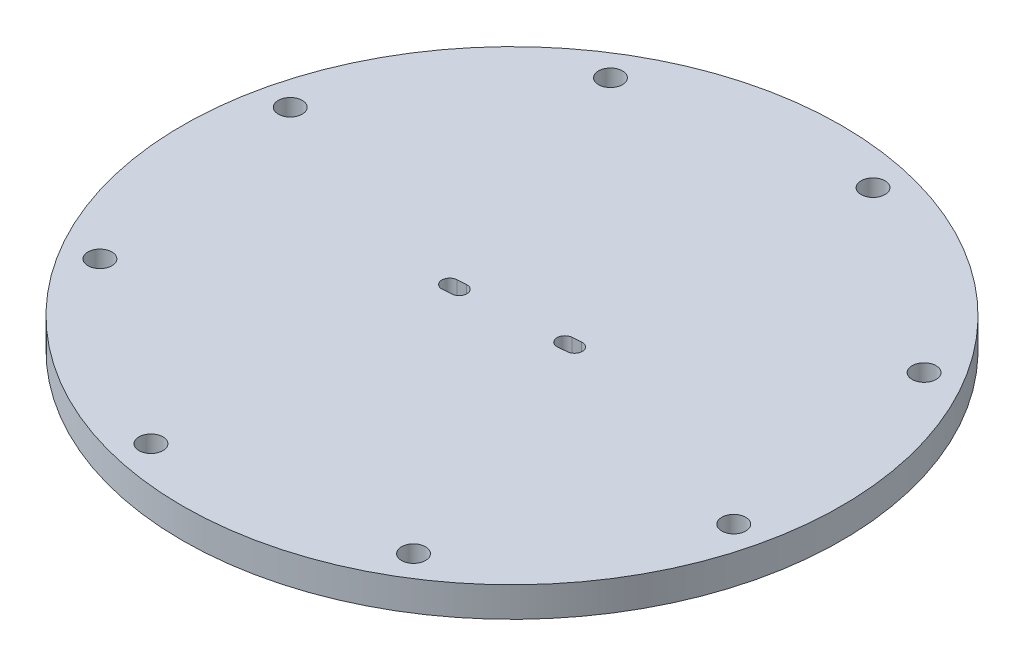
ISO-10303-21;
HEADER;
FILE_DESCRIPTION(('STEP AP214'),'2;1');
FILE_NAME('part.step','',(''),(''),'','','');
FILE_SCHEMA(('AUTOMOTIVE_DESIGN { 1 0 10303 214 1 1 1 1 }'));
ENDSEC;
DATA;
#1=APPLICATION_CONTEXT('core data for automotive mechanical design processes');
#2=APPLICATION_PROTOCOL_DEFINITION('international standard','automotive_design',2000,#1);
#3=PRODUCT_CONTEXT('',#1,'mechanical');
#4=PRODUCT('Part','Part','',(#3));
#5=PRODUCT_RELATED_PRODUCT_CATEGORY('part','',(#4));
#6=PRODUCT_DEFINITION_FORMATION('','',#4);
#7=PRODUCT_DEFINITION_CONTEXT('part definition',#1,'design');
#8=PRODUCT_DEFINITION('design','',#6,#7);
#9=PRODUCT_DEFINITION_SHAPE('','',#8);
#10=(LENGTH_UNIT() NAMED_UNIT(*) SI_UNIT(.MILLI.,.METRE.));
#11=(NAMED_UNIT(*) PLANE_ANGLE_UNIT() SI_UNIT($,.RADIAN.));
#12=(NAMED_UNIT(*) SI_UNIT($,.STERADIAN.) SOLID_ANGLE_UNIT());
#13=UNCERTAINTY_MEASURE_WITH_UNIT(LENGTH_MEASURE(1.E-05),#10,'distance_accuracy_value','');
#14=(GEOMETRIC_REPRESENTATION_CONTEXT(3) GLOBAL_UNCERTAINTY_ASSIGNED_CONTEXT((#13)) GLOBAL_UNIT_ASSIGNED_CONTEXT((#10,
#11,#12)) REPRESENTATION_CONTEXT('',''));
#15=CARTESIAN_POINT('',(0.,0.,0.));
#16=DIRECTION('',(0.,0.,1.));
#17=DIRECTION('',(1.,0.,0.));
#18=AXIS2_PLACEMENT_3D('',#15,#16,#17);
#19=CARTESIAN_POINT('',(0.,10.,0.));
#20=DIRECTION('',(0.,-1.,0.));
#21=DIRECTION('',(0.,0.,-1.));
#22=AXIS2_PLACEMENT_3D('',#19,#20,#21);
#23=CYLINDRICAL_SURFACE('',#22,110.);
#24=CARTESIAN_POINT('',(0.,10.,0.));
#25=DIRECTION('',(0.,1.,0.));
#26=DIRECTION('',(0.,0.,1.));
#27=AXIS2_PLACEMENT_3D('',#24,#25,#26);
#28=CIRCLE('',#27,110.);
#29=CARTESIAN_POINT('',(0.,10.,110.));
#30=VERTEX_POINT('',#29);
#31=EDGE_CURVE('E11',#30,#30,#28,.T.);
#32=ORIENTED_EDGE('',*,*,#31,.F.);
#33=EDGE_LOOP('',(#32));
#34=FACE_BOUND('',#33,.T.);
#35=CARTESIAN_POINT('',(0.,0.,0.));
#36=DIRECTION('',(0.,1.,0.));
#37=DIRECTION('',(0.,0.,1.));
#38=AXIS2_PLACEMENT_3D('',#35,#36,#37);
#39=CIRCLE('',#38,110.);
#40=CARTESIAN_POINT('',(0.,0.,110.));
#41=VERTEX_POINT('',#40);
#42=EDGE_CURVE('E40',#41,#41,#39,.T.);
#43=ORIENTED_EDGE('',*,*,#42,.T.);
#44=EDGE_LOOP('',(#43));
#45=FACE_BOUND('',#44,.T.);
#46=ADVANCED_FACE('F37',(#34,#45),#23,.T.);
#47=CARTESIAN_POINT('',(0.,10.,0.));
#48=DIRECTION('',(0.,1.,0.));
#49=DIRECTION('',(0.,0.,1.));
#50=AXIS2_PLACEMENT_3D('',#47,#48,#49);
#51=PLANE('',#50);
#52=CARTESIAN_POINT('',(-23.2434413577419,10.,97.2612072403444));
#53=DIRECTION('',(0.,1.,0.));
#54=DIRECTION('',(0.,0.,1.));
#55=AXIS2_PLACEMENT_3D('',#52,#53,#54);
#56=CIRCLE('',#55,4.00000000000002);
#57=CARTESIAN_POINT('',(-23.2434413577419,10.,101.261207240344));
#58=VERTEX_POINT('',#57);
#59=EDGE_CURVE('E302',#58,#58,#56,.T.);
#60=ORIENTED_EDGE('',*,*,#59,.F.);
#61=EDGE_LOOP('',(#60));
#62=FACE_BOUND('',#61,.T.);
#63=CARTESIAN_POINT('',(52.3384641838666,10.,85.2096541882088));
#64=DIRECTION('',(0.,1.,0.));
#65=DIRECTION('',(0.,0.,1.));
#66=AXIS2_PLACEMENT_3D('',#63,#64,#65);
#67=CIRCLE('',#66,4.);
#68=CARTESIAN_POINT('',(52.3384641838666,10.,89.2096541882088));
#69=VERTEX_POINT('',#68);
#70=EDGE_CURVE('E296',#69,#69,#67,.T.);
#71=ORIENTED_EDGE('',*,*,#70,.F.);
#72=EDGE_LOOP('',(#71));
#73=FACE_BOUND('',#72,.T.);
#74=CARTESIAN_POINT('',(97.2612072403444,10.,23.2434413577418));
#75=DIRECTION('',(0.,1.,0.));
#76=DIRECTION('',(0.,0.,1.));
#77=AXIS2_PLACEMENT_3D('',#74,#75,#76);
#78=CIRCLE('',#77,4.00000000000001);
#79=CARTESIAN_POINT('',(97.2612072403444,10.,27.2434413577418));
#80=VERTEX_POINT('',#79);
#81=EDGE_CURVE('E290',#80,#80,#78,.T.);
#82=ORIENTED_EDGE('',*,*,#81,.F.);
#83=EDGE_LOOP('',(#82));
#84=FACE_BOUND('',#83,.T.);
#85=CARTESIAN_POINT('',(85.2096541882088,10.,-52.3384641838666));
#86=DIRECTION('',(0.,1.,0.));
#87=DIRECTION('',(0.,0.,1.));
#88=AXIS2_PLACEMENT_3D('',#85,#86,#87);
#89=CIRCLE('',#88,4.00000000000002);
#90=CARTESIAN_POINT('',(85.2096541882088,10.,-48.3384641838665));
#91=VERTEX_POINT('',#90);
#92=EDGE_CURVE('E284',#91,#91,#89,.T.);
#93=ORIENTED_EDGE('',*,*,#92,.F.);
#94=EDGE_LOOP('',(#93));
#95=FACE_BOUND('',#94,.T.);
#96=CARTESIAN_POINT('',(23.2434413577418,10.,-97.2612072403444));
#97=DIRECTION('',(0.,1.,0.));
#98=DIRECTION('',(0.,0.,1.));
#99=AXIS2_PLACEMENT_3D('',#96,#97,#98);
#100=CIRCLE('',#99,4.00000000000002);
#101=CARTESIAN_POINT('',(23.2434413577418,10.,-93.2612072403444));
#102=VERTEX_POINT('',#101);
#103=EDGE_CURVE('E278',#102,#102,#100,.T.);
#104=ORIENTED_EDGE('',*,*,#103,.F.);
#105=EDGE_LOOP('',(#104));
#106=FACE_BOUND('',#105,.T.);
#107=CARTESIAN_POINT('',(-52.3384641838666,10.,-85.2096541882088));
#108=DIRECTION('',(0.,1.,0.));
#109=DIRECTION('',(0.,0.,1.));
#110=AXIS2_PLACEMENT_3D('',#107,#108,#109);
#111=CIRCLE('',#110,4.00000000000001);
#112=CARTESIAN_POINT('',(-52.3384641838666,10.,-81.2096541882088));
#113=VERTEX_POINT('',#112);
#114=EDGE_CURVE('E270',#113,#113,#111,.T.);
#115=ORIENTED_EDGE('',*,*,#114,.F.);
#116=EDGE_LOOP('',(#115));
#117=FACE_BOUND('',#116,.T.);
#118=CARTESIAN_POINT('',(-97.2612072403444,10.,-23.2434413577418));
#119=DIRECTION('',(0.,1.,0.));
#120=DIRECTION('',(0.,0.,1.));
#121=AXIS2_PLACEMENT_3D('',#118,#119,#120);
#122=CIRCLE('',#121,4.00000000000001);
#123=CARTESIAN_POINT('',(-97.2612072403444,10.,-19.2434413577418));
#124=VERTEX_POINT('',#123);
#125=EDGE_CURVE('E266',#124,#124,#122,.T.);
#126=ORIENTED_EDGE('',*,*,#125,.F.);
#127=EDGE_LOOP('',(#126));
#128=FACE_BOUND('',#127,.T.);
#129=CARTESIAN_POINT('',(-85.2096541882088,10.,52.3384641838666));
#130=DIRECTION('',(0.,1.,0.));
#131=DIRECTION('',(0.,0.,1.));
#132=AXIS2_PLACEMENT_3D('',#129,#130,#131);
#133=CIRCLE('',#132,4.00000000000002);
#134=CARTESIAN_POINT('',(-85.2096541882088,10.,56.3384641838666));
#135=VERTEX_POINT('',#134);
#136=EDGE_CURVE('E128',#135,#135,#133,.T.);
#137=ORIENTED_EDGE('',*,*,#136,.F.);
#138=EDGE_LOOP('',(#137));
#139=FACE_BOUND('',#138,.T.);
#140=CARTESIAN_POINT('',(-19.450396082498,10.,1.3899972064521));
#141=DIRECTION('',(0.,1.,0.));
#142=DIRECTION('',(0.,0.,1.));
#143=AXIS2_PLACEMENT_3D('',#140,#141,#142);
#144=CIRCLE('',#143,2.59703660998172);
#145=CARTESIAN_POINT('',(-19.6355178072636,10.,-1.20043308610649));
#146=VERTEX_POINT('',#145);
#147=CARTESIAN_POINT('',(-19.2652743577325,10.,3.98042749901068));
#148=VERTEX_POINT('',#147);
#149=EDGE_CURVE('E51',#146,#148,#144,.T.);
#150=ORIENTED_EDGE('',*,*,#149,.F.);
#151=DIRECTION('',(-0.997456209358874,0.,0.0712819080231845));
#152=VECTOR('',#151,1.);
#153=CARTESIAN_POINT('',(-19.6355178072636,10.,-1.20043308610649));
#154=LINE('',#153,#152);
#155=CARTESIAN_POINT('',(-16.643149179187,10.,-1.41427881017604));
#156=VERTEX_POINT('',#155);
#157=EDGE_CURVE('E122',#156,#146,#154,.T.);
#158=ORIENTED_EDGE('',*,*,#157,.F.);
#159=CARTESIAN_POINT('',(-16.4580274544214,10.,1.17615148238254));
#160=DIRECTION('',(0.,1.,0.));
#161=DIRECTION('',(0.,0.,1.));
#162=AXIS2_PLACEMENT_3D('',#159,#160,#161);
#163=CIRCLE('',#162,2.59703660998172);
#164=CARTESIAN_POINT('',(-16.2729057296559,10.,3.76658177494113));
#165=VERTEX_POINT('',#164);
#166=EDGE_CURVE('E125',#165,#156,#163,.T.);
#167=ORIENTED_EDGE('',*,*,#166,.F.);
#168=DIRECTION('',(0.997456209358874,0.,-0.0712819080231845));
#169=VECTOR('',#168,1.);
#170=CARTESIAN_POINT('',(-19.2652743577325,10.,3.98042749901068));
#171=LINE('',#170,#169);
#172=EDGE_CURVE('E134',#148,#165,#171,.T.);
#173=ORIENTED_EDGE('',*,*,#172,.F.);
#174=EDGE_LOOP('',(#150,#158,#167,#173));
#175=FACE_BOUND('',#174,.T.);
#176=CARTESIAN_POINT('',(16.4580274544214,10.,-1.17615148238254));
#177=DIRECTION('',(0.,1.,0.));
#178=DIRECTION('',(0.,0.,1.));
#179=AXIS2_PLACEMENT_3D('',#176,#177,#178);
#180=CIRCLE('',#179,2.61641913849009);
#181=CARTESIAN_POINT('',(16.2447532871279,10.,-3.78386374369944));
#182=VERTEX_POINT('',#181);
#183=CARTESIAN_POINT('',(16.6713016217149,10.,1.43156077893436));
#184=VERTEX_POINT('',#183);
#185=EDGE_CURVE('E59',#182,#184,#180,.T.);
#186=ORIENTED_EDGE('',*,*,#185,.F.);
#187=DIRECTION('',(-0.996672216219067,0.,0.0815137621323789));
#188=VECTOR('',#187,1.);
#189=CARTESIAN_POINT('',(16.2447532871279,10.,-3.78386374369944));
#190=LINE('',#189,#188);
#191=CARTESIAN_POINT('',(19.2371219152046,10.,-4.02859738891607));
#192=VERTEX_POINT('',#191);
#193=EDGE_CURVE('E153',#192,#182,#190,.T.);
#194=ORIENTED_EDGE('',*,*,#193,.F.);
#195=CARTESIAN_POINT('',(19.450396082498,10.,-1.42088512759917));
#196=DIRECTION('',(0.,1.,0.));
#197=DIRECTION('',(0.,0.,1.));
#198=AXIS2_PLACEMENT_3D('',#195,#196,#197);
#199=CIRCLE('',#198,2.61641913849009);
#200=CARTESIAN_POINT('',(19.6636702497915,10.,1.18682713371773));
#201=VERTEX_POINT('',#200);
#202=EDGE_CURVE('E156',#201,#192,#199,.T.);
#203=ORIENTED_EDGE('',*,*,#202,.F.);
#204=DIRECTION('',(0.996672216219067,0.,-0.081513762132379));
#205=VECTOR('',#204,1.);
#206=CARTESIAN_POINT('',(16.6713016217149,10.,1.43156077893436));
#207=LINE('',#206,#205);
#208=EDGE_CURVE('E160',#184,#201,#207,.T.);
#209=ORIENTED_EDGE('',*,*,#208,.F.);
#210=EDGE_LOOP('',(#186,#194,#203,#209));
#211=FACE_BOUND('',#210,.T.);
#212=ORIENTED_EDGE('',*,*,#31,.T.);
#213=EDGE_LOOP('',(#212));
#214=FACE_BOUND('',#213,.T.);
#215=ADVANCED_FACE('F189',(#62,#73,#84,#95,#106,#117,#128,#139,#175,#211,#214),#51,.T.);
#216=CARTESIAN_POINT('',(0.,0.,0.));
#217=DIRECTION('',(0.,1.,0.));
#218=DIRECTION('',(0.,0.,1.));
#219=AXIS2_PLACEMENT_3D('',#216,#217,#218);
#220=PLANE('',#219);
#221=CARTESIAN_POINT('',(-23.2434413577419,0.,97.2612072403444));
#222=DIRECTION('',(0.,1.,0.));
#223=DIRECTION('',(0.,0.,1.));
#224=AXIS2_PLACEMENT_3D('',#221,#222,#223);
#225=CIRCLE('',#224,4.00000000000002);
#226=CARTESIAN_POINT('',(-23.2434413577419,0.,101.261207240344));
#227=VERTEX_POINT('',#226);
#228=EDGE_CURVE('E305',#227,#227,#225,.T.);
#229=ORIENTED_EDGE('',*,*,#228,.T.);
#230=EDGE_LOOP('',(#229));
#231=FACE_BOUND('',#230,.T.);
#232=CARTESIAN_POINT('',(52.3384641838666,0.,85.2096541882088));
#233=DIRECTION('',(0.,1.,0.));
#234=DIRECTION('',(0.,0.,1.));
#235=AXIS2_PLACEMENT_3D('',#232,#233,#234);
#236=CIRCLE('',#235,4.);
#237=CARTESIAN_POINT('',(52.3384641838666,0.,89.2096541882088));
#238=VERTEX_POINT('',#237);
#239=EDGE_CURVE('E299',#238,#238,#236,.T.);
#240=ORIENTED_EDGE('',*,*,#239,.T.);
#241=EDGE_LOOP('',(#240));
#242=FACE_BOUND('',#241,.T.);
#243=CARTESIAN_POINT('',(97.2612072403444,0.,23.2434413577418));
#244=DIRECTION('',(0.,1.,0.));
#245=DIRECTION('',(0.,0.,1.));
#246=AXIS2_PLACEMENT_3D('',#243,#244,#245);
#247=CIRCLE('',#246,4.00000000000001);
#248=CARTESIAN_POINT('',(97.2612072403444,0.,27.2434413577418));
#249=VERTEX_POINT('',#248);
#250=EDGE_CURVE('E293',#249,#249,#247,.T.);
#251=ORIENTED_EDGE('',*,*,#250,.T.);
#252=EDGE_LOOP('',(#251));
#253=FACE_BOUND('',#252,.T.);
#254=CARTESIAN_POINT('',(85.2096541882088,0.,-52.3384641838666));
#255=DIRECTION('',(0.,1.,0.));
#256=DIRECTION('',(0.,0.,1.));
#257=AXIS2_PLACEMENT_3D('',#254,#255,#256);
#258=CIRCLE('',#257,4.00000000000002);
#259=CARTESIAN_POINT('',(85.2096541882088,0.,-48.3384641838665));
#260=VERTEX_POINT('',#259);
#261=EDGE_CURVE('E287',#260,#260,#258,.T.);
#262=ORIENTED_EDGE('',*,*,#261,.T.);
#263=EDGE_LOOP('',(#262));
#264=FACE_BOUND('',#263,.T.);
#265=CARTESIAN_POINT('',(23.2434413577418,0.,-97.2612072403444));
#266=DIRECTION('',(0.,1.,0.));
#267=DIRECTION('',(0.,0.,1.));
#268=AXIS2_PLACEMENT_3D('',#265,#266,#267);
#269=CIRCLE('',#268,4.00000000000002);
#270=CARTESIAN_POINT('',(23.2434413577418,0.,-93.2612072403444));
#271=VERTEX_POINT('',#270);
#272=EDGE_CURVE('E281',#271,#271,#269,.T.);
#273=ORIENTED_EDGE('',*,*,#272,.T.);
#274=EDGE_LOOP('',(#273));
#275=FACE_BOUND('',#274,.T.);
#276=CARTESIAN_POINT('',(-52.3384641838666,0.,-85.2096541882088));
#277=DIRECTION('',(0.,1.,0.));
#278=DIRECTION('',(0.,0.,1.));
#279=AXIS2_PLACEMENT_3D('',#276,#277,#278);
#280=CIRCLE('',#279,4.00000000000001);
#281=CARTESIAN_POINT('',(-52.3384641838666,0.,-81.2096541882088));
#282=VERTEX_POINT('',#281);
#283=EDGE_CURVE('E275',#282,#282,#280,.T.);
#284=ORIENTED_EDGE('',*,*,#283,.T.);
#285=EDGE_LOOP('',(#284));
#286=FACE_BOUND('',#285,.T.);
#287=CARTESIAN_POINT('',(-97.2612072403444,0.,-23.2434413577418));
#288=DIRECTION('',(0.,1.,0.));
#289=DIRECTION('',(0.,0.,1.));
#290=AXIS2_PLACEMENT_3D('',#287,#288,#289);
#291=CIRCLE('',#290,4.00000000000001);
#292=CARTESIAN_POINT('',(-97.2612072403444,0.,-19.2434413577418));
#293=VERTEX_POINT('',#292);
#294=EDGE_CURVE('E263',#293,#293,#291,.T.);
#295=ORIENTED_EDGE('',*,*,#294,.T.);
#296=EDGE_LOOP('',(#295));
#297=FACE_BOUND('',#296,.T.);
#298=CARTESIAN_POINT('',(-85.2096541882088,0.,52.3384641838666));
#299=DIRECTION('',(0.,1.,0.));
#300=DIRECTION('',(0.,0.,1.));
#301=AXIS2_PLACEMENT_3D('',#298,#299,#300);
#302=CIRCLE('',#301,4.00000000000002);
#303=CARTESIAN_POINT('',(-85.2096541882088,0.,56.3384641838666));
#304=VERTEX_POINT('',#303);
#305=EDGE_CURVE('E152',#304,#304,#302,.T.);
#306=ORIENTED_EDGE('',*,*,#305,.T.);
#307=EDGE_LOOP('',(#306));
#308=FACE_BOUND('',#307,.T.);
#309=DIRECTION('',(-0.997456209358874,0.,0.0712819080231845));
#310=VECTOR('',#309,1.);
#311=CARTESIAN_POINT('',(-19.6355178072636,0.,-1.20043308610649));
#312=LINE('',#311,#310);
#313=CARTESIAN_POINT('',(-16.643149179187,0.,-1.41427881017604));
#314=VERTEX_POINT('',#313);
#315=CARTESIAN_POINT('',(-19.6355178072636,0.,-1.20043308610649));
#316=VERTEX_POINT('',#315);
#317=EDGE_CURVE('E109',#314,#316,#312,.T.);
#318=ORIENTED_EDGE('',*,*,#317,.T.);
#319=CARTESIAN_POINT('',(-19.450396082498,0.,1.3899972064521));
#320=DIRECTION('',(0.,1.,0.));
#321=DIRECTION('',(0.,0.,1.));
#322=AXIS2_PLACEMENT_3D('',#319,#320,#321);
#323=CIRCLE('',#322,2.59703660998172);
#324=CARTESIAN_POINT('',(-19.2652743577325,0.,3.98042749901068));
#325=VERTEX_POINT('',#324);
#326=EDGE_CURVE('E103',#316,#325,#323,.T.);
#327=ORIENTED_EDGE('',*,*,#326,.T.);
#328=DIRECTION('',(0.997456209358874,0.,-0.0712819080231845));
#329=VECTOR('',#328,1.);
#330=CARTESIAN_POINT('',(-19.2652743577325,0.,3.98042749901068));
#331=LINE('',#330,#329);
#332=CARTESIAN_POINT('',(-16.2729057296559,0.,3.76658177494113));
#333=VERTEX_POINT('',#332);
#334=EDGE_CURVE('E113',#325,#333,#331,.T.);
#335=ORIENTED_EDGE('',*,*,#334,.T.);
#336=CARTESIAN_POINT('',(-16.4580274544214,0.,1.17615148238254));
#337=DIRECTION('',(0.,1.,0.));
#338=DIRECTION('',(0.,0.,1.));
#339=AXIS2_PLACEMENT_3D('',#336,#337,#338);
#340=CIRCLE('',#339,2.59703660998172);
#341=EDGE_CURVE('E117',#333,#314,#340,.T.);
#342=ORIENTED_EDGE('',*,*,#341,.T.);
#343=EDGE_LOOP('',(#318,#327,#335,#342));
#344=FACE_BOUND('',#343,.T.);
#345=DIRECTION('',(-0.996672216219067,0.,0.0815137621323789));
#346=VECTOR('',#345,1.);
#347=CARTESIAN_POINT('',(16.2447532871279,0.,-3.78386374369944));
#348=LINE('',#347,#346);
#349=CARTESIAN_POINT('',(19.2371219152046,0.,-4.02859738891607));
#350=VERTEX_POINT('',#349);
#351=CARTESIAN_POINT('',(16.2447532871279,0.,-3.78386374369944));
#352=VERTEX_POINT('',#351);
#353=EDGE_CURVE('E145',#350,#352,#348,.T.);
#354=ORIENTED_EDGE('',*,*,#353,.T.);
#355=CARTESIAN_POINT('',(16.4580274544214,0.,-1.17615148238254));
#356=DIRECTION('',(0.,1.,0.));
#357=DIRECTION('',(0.,0.,1.));
#358=AXIS2_PLACEMENT_3D('',#355,#356,#357);
#359=CIRCLE('',#358,2.61641913849009);
#360=CARTESIAN_POINT('',(16.6713016217149,0.,1.43156077893436));
#361=VERTEX_POINT('',#360);
#362=EDGE_CURVE('E157',#352,#361,#359,.T.);
#363=ORIENTED_EDGE('',*,*,#362,.T.);
#364=DIRECTION('',(0.996672216219067,0.,-0.081513762132379));
#365=VECTOR('',#364,1.);
#366=CARTESIAN_POINT('',(16.6713016217149,0.,1.43156077893436));
#367=LINE('',#366,#365);
#368=CARTESIAN_POINT('',(19.6636702497915,0.,1.18682713371773));
#369=VERTEX_POINT('',#368);
#370=EDGE_CURVE('E169',#361,#369,#367,.T.);
#371=ORIENTED_EDGE('',*,*,#370,.T.);
#372=CARTESIAN_POINT('',(19.450396082498,0.,-1.42088512759917));
#373=DIRECTION('',(0.,1.,0.));
#374=DIRECTION('',(0.,0.,1.));
#375=AXIS2_PLACEMENT_3D('',#372,#373,#374);
#376=CIRCLE('',#375,2.61641913849009);
#377=EDGE_CURVE('E166',#369,#350,#376,.T.);
#378=ORIENTED_EDGE('',*,*,#377,.T.);
#379=EDGE_LOOP('',(#354,#363,#371,#378));
#380=FACE_BOUND('',#379,.T.);
#381=ORIENTED_EDGE('',*,*,#42,.F.);
#382=EDGE_LOOP('',(#381));
#383=FACE_BOUND('',#382,.T.);
#384=ADVANCED_FACE('F119',(#231,#242,#253,#264,#275,#286,#297,#308,#344,#380,#383),#220,.F.);
#385=CARTESIAN_POINT('',(16.4580274544214,0.,-1.17615148238254));
#386=DIRECTION('',(0.,1.,0.));
#387=DIRECTION('',(0.,0.,1.));
#388=AXIS2_PLACEMENT_3D('',#385,#386,#387);
#389=CYLINDRICAL_SURFACE('',#388,2.61641913849009);
#390=ORIENTED_EDGE('',*,*,#185,.T.);
#391=DIRECTION('',(0.,1.,0.));
#392=VECTOR('',#391,1.);
#393=CARTESIAN_POINT('',(16.6713016217149,0.,1.43156077893436));
#394=LINE('',#393,#392);
#395=EDGE_CURVE('E143',#361,#184,#394,.T.);
#396=ORIENTED_EDGE('',*,*,#395,.F.);
#397=ORIENTED_EDGE('',*,*,#362,.F.);
#398=DIRECTION('',(0.,1.,0.));
#399=VECTOR('',#398,1.);
#400=CARTESIAN_POINT('',(16.2447532871279,0.,-3.78386374369944));
#401=LINE('',#400,#399);
#402=EDGE_CURVE('E150',#352,#182,#401,.T.);
#403=ORIENTED_EDGE('',*,*,#402,.T.);
#404=EDGE_LOOP('',(#390,#396,#397,#403));
#405=FACE_BOUND('',#404,.T.);
#406=ADVANCED_FACE('F177',(#405),#389,.F.);
#407=CARTESIAN_POINT('',(16.2447532871279,0.,-3.78386374369944));
#408=DIRECTION('',(-0.0815137621323789,0.,-0.996672216219067));
#409=DIRECTION('',(-0.996672216219067,0.,0.0815137621323789));
#410=AXIS2_PLACEMENT_3D('',#407,#408,#409);
#411=PLANE('',#410);
#412=ORIENTED_EDGE('',*,*,#193,.T.);
#413=ORIENTED_EDGE('',*,*,#402,.F.);
#414=ORIENTED_EDGE('',*,*,#353,.F.);
#415=DIRECTION('',(0.,1.,0.));
#416=VECTOR('',#415,1.);
#417=CARTESIAN_POINT('',(19.2371219152046,0.,-4.02859738891607));
#418=LINE('',#417,#416);
#419=EDGE_CURVE('E148',#350,#192,#418,.T.);
#420=ORIENTED_EDGE('',*,*,#419,.T.);
#421=EDGE_LOOP('',(#412,#413,#414,#420));
#422=FACE_BOUND('',#421,.T.);
#423=ADVANCED_FACE('F187',(#422),#411,.F.);
#424=CARTESIAN_POINT('',(19.450396082498,0.,-1.42088512759917));
#425=DIRECTION('',(0.,1.,0.));
#426=DIRECTION('',(0.,0.,1.));
#427=AXIS2_PLACEMENT_3D('',#424,#425,#426);
#428=CYLINDRICAL_SURFACE('',#427,2.61641913849009);
#429=ORIENTED_EDGE('',*,*,#202,.T.);
#430=ORIENTED_EDGE('',*,*,#419,.F.);
#431=ORIENTED_EDGE('',*,*,#377,.F.);
#432=DIRECTION('',(0.,1.,0.));
#433=VECTOR('',#432,1.);
#434=CARTESIAN_POINT('',(19.6636702497915,0.,1.18682713371773));
#435=LINE('',#434,#433);
#436=EDGE_CURVE('E146',#369,#201,#435,.T.);
#437=ORIENTED_EDGE('',*,*,#436,.T.);
#438=EDGE_LOOP('',(#429,#430,#431,#437));
#439=FACE_BOUND('',#438,.T.);
#440=ADVANCED_FACE('F184',(#439),#428,.F.);
#441=CARTESIAN_POINT('',(16.6713016217149,0.,1.43156077893436));
#442=DIRECTION('',(0.081513762132379,0.,0.996672216219067));
#443=DIRECTION('',(0.996672216219067,0.,-0.081513762132379));
#444=AXIS2_PLACEMENT_3D('',#441,#442,#443);
#445=PLANE('',#444);
#446=ORIENTED_EDGE('',*,*,#208,.T.);
#447=ORIENTED_EDGE('',*,*,#436,.F.);
#448=ORIENTED_EDGE('',*,*,#370,.F.);
#449=ORIENTED_EDGE('',*,*,#395,.T.);
#450=EDGE_LOOP('',(#446,#447,#448,#449));
#451=FACE_BOUND('',#450,.T.);
#452=ADVANCED_FACE('F181',(#451),#445,.F.);
#453=CARTESIAN_POINT('',(-19.450396082498,0.,1.3899972064521));
#454=DIRECTION('',(0.,1.,0.));
#455=DIRECTION('',(0.,0.,1.));
#456=AXIS2_PLACEMENT_3D('',#453,#454,#455);
#457=CYLINDRICAL_SURFACE('',#456,2.59703660998172);
#458=ORIENTED_EDGE('',*,*,#149,.T.);
#459=DIRECTION('',(0.,1.,0.));
#460=VECTOR('',#459,1.);
#461=CARTESIAN_POINT('',(-19.2652743577325,0.,3.98042749901068));
#462=LINE('',#461,#460);
#463=EDGE_CURVE('E99',#325,#148,#462,.T.);
#464=ORIENTED_EDGE('',*,*,#463,.F.);
#465=ORIENTED_EDGE('',*,*,#326,.F.);
#466=DIRECTION('',(0.,1.,0.));
#467=VECTOR('',#466,1.);
#468=CARTESIAN_POINT('',(-19.6355178072636,0.,-1.20043308610649));
#469=LINE('',#468,#467);
#470=EDGE_CURVE('E138',#316,#146,#469,.T.);
#471=ORIENTED_EDGE('',*,*,#470,.T.);
#472=EDGE_LOOP('',(#458,#464,#465,#471));
#473=FACE_BOUND('',#472,.T.);
#474=ADVANCED_FACE('F101',(#473),#457,.F.);
#475=CARTESIAN_POINT('',(-19.6355178072636,0.,-1.20043308610649));
#476=DIRECTION('',(-0.0712819080231845,0.,-0.997456209358874));
#477=DIRECTION('',(-0.997456209358874,0.,0.0712819080231845));
#478=AXIS2_PLACEMENT_3D('',#475,#476,#477);
#479=PLANE('',#478);
#480=ORIENTED_EDGE('',*,*,#157,.T.);
#481=ORIENTED_EDGE('',*,*,#470,.F.);
#482=ORIENTED_EDGE('',*,*,#317,.F.);
#483=DIRECTION('',(0.,1.,0.));
#484=VECTOR('',#483,1.);
#485=CARTESIAN_POINT('',(-16.643149179187,0.,-1.41427881017604));
#486=LINE('',#485,#484);
#487=EDGE_CURVE('E140',#314,#156,#486,.T.);
#488=ORIENTED_EDGE('',*,*,#487,.T.);
#489=EDGE_LOOP('',(#480,#481,#482,#488));
#490=FACE_BOUND('',#489,.T.);
#491=ADVANCED_FACE('F217',(#490),#479,.F.);
#492=CARTESIAN_POINT('',(-16.4580274544214,0.,1.17615148238254));
#493=DIRECTION('',(0.,1.,0.));
#494=DIRECTION('',(0.,0.,1.));
#495=AXIS2_PLACEMENT_3D('',#492,#493,#494);
#496=CYLINDRICAL_SURFACE('',#495,2.59703660998172);
#497=ORIENTED_EDGE('',*,*,#166,.T.);
#498=ORIENTED_EDGE('',*,*,#487,.F.);
#499=ORIENTED_EDGE('',*,*,#341,.F.);
#500=DIRECTION('',(0.,1.,0.));
#501=VECTOR('',#500,1.);
#502=CARTESIAN_POINT('',(-16.2729057296559,0.,3.76658177494113));
#503=LINE('',#502,#501);
#504=EDGE_CURVE('E108',#333,#165,#503,.T.);
#505=ORIENTED_EDGE('',*,*,#504,.T.);
#506=EDGE_LOOP('',(#497,#498,#499,#505));
#507=FACE_BOUND('',#506,.T.);
#508=ADVANCED_FACE('F221',(#507),#496,.F.);
#509=CARTESIAN_POINT('',(-19.2652743577325,0.,3.98042749901068));
#510=DIRECTION('',(0.0712819080231845,0.,0.997456209358874));
#511=DIRECTION('',(0.997456209358874,0.,-0.0712819080231845));
#512=AXIS2_PLACEMENT_3D('',#509,#510,#511);
#513=PLANE('',#512);
#514=ORIENTED_EDGE('',*,*,#172,.T.);
#515=ORIENTED_EDGE('',*,*,#504,.F.);
#516=ORIENTED_EDGE('',*,*,#334,.F.);
#517=ORIENTED_EDGE('',*,*,#463,.T.);
#518=EDGE_LOOP('',(#514,#515,#516,#517));
#519=FACE_BOUND('',#518,.T.);
#520=ADVANCED_FACE('F114',(#519),#513,.F.);
#521=CARTESIAN_POINT('',(-85.2096541882088,0.,52.3384641838666));
#522=DIRECTION('',(0.,1.,0.));
#523=DIRECTION('',(0.,0.,1.));
#524=AXIS2_PLACEMENT_3D('',#521,#522,#523);
#525=CYLINDRICAL_SURFACE('',#524,4.00000000000002);
#526=ORIENTED_EDGE('',*,*,#305,.F.);
#527=EDGE_LOOP('',(#526));
#528=FACE_BOUND('',#527,.T.);
#529=ORIENTED_EDGE('',*,*,#136,.T.);
#530=EDGE_LOOP('',(#529));
#531=FACE_BOUND('',#530,.T.);
#532=ADVANCED_FACE('F220',(#528,#531),#525,.F.);
#533=CARTESIAN_POINT('',(-97.2612072403444,0.,-23.2434413577418));
#534=DIRECTION('',(0.,1.,0.));
#535=DIRECTION('',(0.,0.,1.));
#536=AXIS2_PLACEMENT_3D('',#533,#534,#535);
#537=CYLINDRICAL_SURFACE('',#536,4.00000000000001);
#538=ORIENTED_EDGE('',*,*,#294,.F.);
#539=EDGE_LOOP('',(#538));
#540=FACE_BOUND('',#539,.T.);
#541=ORIENTED_EDGE('',*,*,#125,.T.);
#542=EDGE_LOOP('',(#541));
#543=FACE_BOUND('',#542,.T.);
#544=ADVANCED_FACE('F230',(#540,#543),#537,.F.);
#545=CARTESIAN_POINT('',(-52.3384641838666,0.,-85.2096541882088));
#546=DIRECTION('',(0.,1.,0.));
#547=DIRECTION('',(0.,0.,1.));
#548=AXIS2_PLACEMENT_3D('',#545,#546,#547);
#549=CYLINDRICAL_SURFACE('',#548,4.00000000000001);
#550=ORIENTED_EDGE('',*,*,#283,.F.);
#551=EDGE_LOOP('',(#550));
#552=FACE_BOUND('',#551,.T.);
#553=ORIENTED_EDGE('',*,*,#114,.T.);
#554=EDGE_LOOP('',(#553));
#555=FACE_BOUND('',#554,.T.);
#556=ADVANCED_FACE('F251',(#552,#555),#549,.F.);
#557=CARTESIAN_POINT('',(23.2434413577418,0.,-97.2612072403444));
#558=DIRECTION('',(0.,1.,0.));
#559=DIRECTION('',(0.,0.,1.));
#560=AXIS2_PLACEMENT_3D('',#557,#558,#559);
#561=CYLINDRICAL_SURFACE('',#560,4.00000000000002);
#562=ORIENTED_EDGE('',*,*,#272,.F.);
#563=EDGE_LOOP('',(#562));
#564=FACE_BOUND('',#563,.T.);
#565=ORIENTED_EDGE('',*,*,#103,.T.);
#566=EDGE_LOOP('',(#565));
#567=FACE_BOUND('',#566,.T.);
#568=ADVANCED_FACE('F247',(#564,#567),#561,.F.);
#569=CARTESIAN_POINT('',(85.2096541882088,0.,-52.3384641838666));
#570=DIRECTION('',(0.,1.,0.));
#571=DIRECTION('',(0.,0.,1.));
#572=AXIS2_PLACEMENT_3D('',#569,#570,#571);
#573=CYLINDRICAL_SURFACE('',#572,4.00000000000002);
#574=ORIENTED_EDGE('',*,*,#261,.F.);
#575=EDGE_LOOP('',(#574));
#576=FACE_BOUND('',#575,.T.);
#577=ORIENTED_EDGE('',*,*,#92,.T.);
#578=EDGE_LOOP('',(#577));
#579=FACE_BOUND('',#578,.T.);
#580=ADVANCED_FACE('F243',(#576,#579),#573,.F.);
#581=CARTESIAN_POINT('',(97.2612072403444,0.,23.2434413577418));
#582=DIRECTION('',(0.,1.,0.));
#583=DIRECTION('',(0.,0.,1.));
#584=AXIS2_PLACEMENT_3D('',#581,#582,#583);
#585=CYLINDRICAL_SURFACE('',#584,4.00000000000001);
#586=ORIENTED_EDGE('',*,*,#250,.F.);
#587=EDGE_LOOP('',(#586));
#588=FACE_BOUND('',#587,.T.);
#589=ORIENTED_EDGE('',*,*,#81,.T.);
#590=EDGE_LOOP('',(#589));
#591=FACE_BOUND('',#590,.T.);
#592=ADVANCED_FACE('F239',(#588,#591),#585,.F.);
#593=CARTESIAN_POINT('',(52.3384641838666,0.,85.2096541882088));
#594=DIRECTION('',(0.,1.,0.));
#595=DIRECTION('',(0.,0.,1.));
#596=AXIS2_PLACEMENT_3D('',#593,#594,#595);
#597=CYLINDRICAL_SURFACE('',#596,4.);
#598=ORIENTED_EDGE('',*,*,#239,.F.);
#599=EDGE_LOOP('',(#598));
#600=FACE_BOUND('',#599,.T.);
#601=ORIENTED_EDGE('',*,*,#70,.T.);
#602=EDGE_LOOP('',(#601));
#603=FACE_BOUND('',#602,.T.);
#604=ADVANCED_FACE('F235',(#600,#603),#597,.F.);
#605=CARTESIAN_POINT('',(-23.2434413577419,0.,97.2612072403444));
#606=DIRECTION('',(0.,1.,0.));
#607=DIRECTION('',(0.,0.,1.));
#608=AXIS2_PLACEMENT_3D('',#605,#606,#607);
#609=CYLINDRICAL_SURFACE('',#608,4.00000000000002);
#610=ORIENTED_EDGE('',*,*,#228,.F.);
#611=EDGE_LOOP('',(#610));
#612=FACE_BOUND('',#611,.T.);
#613=ORIENTED_EDGE('',*,*,#59,.T.);
#614=EDGE_LOOP('',(#613));
#615=FACE_BOUND('',#614,.T.);
#616=ADVANCED_FACE('F232',(#612,#615),#609,.F.);
#617=CLOSED_SHELL('',(#46,#215,#384,#406,#423,#440,#452,#474,#491,#508,#520,#532,#544,#556,#568,
#580,#592,#604,#616));
#618=MANIFOLD_SOLID_BREP('B2',#617);
#619=ADVANCED_BREP_SHAPE_REPRESENTATION('',(#18,#618),#14);
#620=SHAPE_DEFINITION_REPRESENTATION(#9,#619);
ENDSEC;
END-ISO-10303-21;
